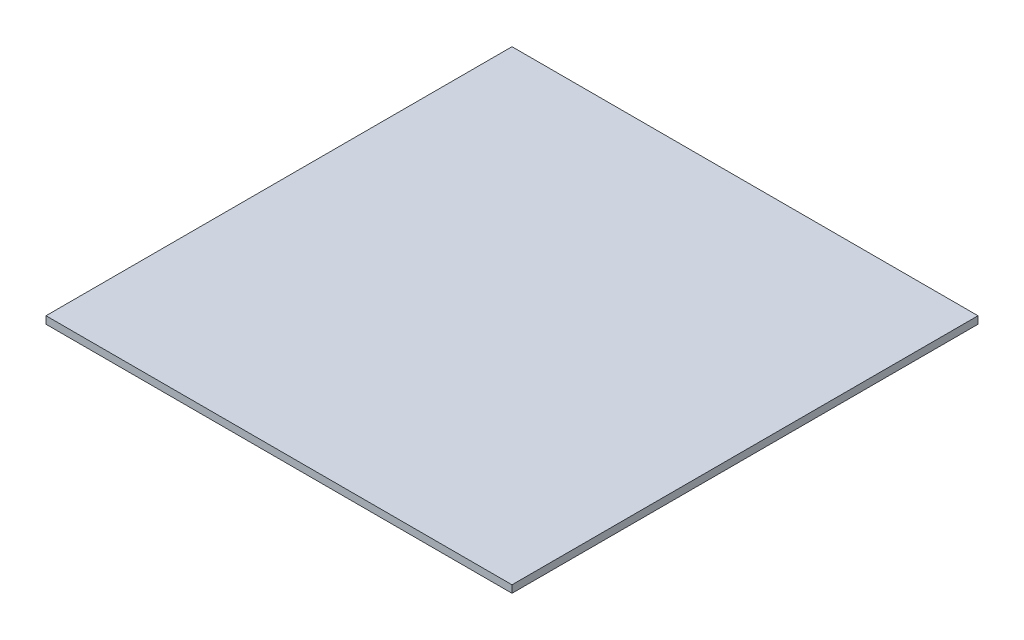
ISO-10303-21;
HEADER;
FILE_DESCRIPTION(('STEP AP214'),'2;1');
FILE_NAME('part.step','',(''),(''),'','','');
FILE_SCHEMA(('AUTOMOTIVE_DESIGN { 1 0 10303 214 1 1 1 1 }'));
ENDSEC;
DATA;
#1=APPLICATION_CONTEXT('core data for automotive mechanical design processes');
#2=APPLICATION_PROTOCOL_DEFINITION('international standard','automotive_design',2000,#1);
#3=PRODUCT_CONTEXT('',#1,'mechanical');
#4=PRODUCT('Part','Part','',(#3));
#5=PRODUCT_RELATED_PRODUCT_CATEGORY('part','',(#4));
#6=PRODUCT_DEFINITION_FORMATION('','',#4);
#7=PRODUCT_DEFINITION_CONTEXT('part definition',#1,'design');
#8=PRODUCT_DEFINITION('design','',#6,#7);
#9=PRODUCT_DEFINITION_SHAPE('','',#8);
#10=(LENGTH_UNIT() NAMED_UNIT(*) SI_UNIT(.MILLI.,.METRE.));
#11=(NAMED_UNIT(*) PLANE_ANGLE_UNIT() SI_UNIT($,.RADIAN.));
#12=(NAMED_UNIT(*) SI_UNIT($,.STERADIAN.) SOLID_ANGLE_UNIT());
#13=UNCERTAINTY_MEASURE_WITH_UNIT(LENGTH_MEASURE(1.E-05),#10,'distance_accuracy_value','');
#14=(GEOMETRIC_REPRESENTATION_CONTEXT(3) GLOBAL_UNCERTAINTY_ASSIGNED_CONTEXT((#13)) GLOBAL_UNIT_ASSIGNED_CONTEXT((#10,
#11,#12)) REPRESENTATION_CONTEXT('',''));
#15=CARTESIAN_POINT('',(0.,0.,0.));
#16=DIRECTION('',(0.,0.,1.));
#17=DIRECTION('',(1.,0.,0.));
#18=AXIS2_PLACEMENT_3D('',#15,#16,#17);
#19=CARTESIAN_POINT('',(100.,3.175,100.));
#20=DIRECTION('',(-1.,0.,0.));
#21=DIRECTION('',(0.,0.,1.));
#22=AXIS2_PLACEMENT_3D('',#19,#20,#21);
#23=PLANE('',#22);
#24=DIRECTION('',(0.,0.,-1.));
#25=VECTOR('',#24,1.);
#26=CARTESIAN_POINT('',(100.,0.,100.));
#27=LINE('',#26,#25);
#28=CARTESIAN_POINT('',(100.,0.,100.));
#29=VERTEX_POINT('',#28);
#30=CARTESIAN_POINT('',(100.,0.,-100.));
#31=VERTEX_POINT('',#30);
#32=EDGE_CURVE('E96',#29,#31,#27,.T.);
#33=ORIENTED_EDGE('',*,*,#32,.T.);
#34=DIRECTION('',(0.,-1.,0.));
#35=VECTOR('',#34,1.);
#36=CARTESIAN_POINT('',(100.,3.175,-100.));
#37=LINE('',#36,#35);
#38=CARTESIAN_POINT('',(100.,3.175,-100.));
#39=VERTEX_POINT('',#38);
#40=EDGE_CURVE('E11',#39,#31,#37,.T.);
#41=ORIENTED_EDGE('',*,*,#40,.F.);
#42=DIRECTION('',(0.,0.,-1.));
#43=VECTOR('',#42,1.);
#44=CARTESIAN_POINT('',(100.,3.175,100.));
#45=LINE('',#44,#43);
#46=CARTESIAN_POINT('',(100.,3.175,100.));
#47=VERTEX_POINT('',#46);
#48=EDGE_CURVE('E84',#47,#39,#45,.T.);
#49=ORIENTED_EDGE('',*,*,#48,.F.);
#50=DIRECTION('',(0.,-1.,0.));
#51=VECTOR('',#50,1.);
#52=CARTESIAN_POINT('',(100.,3.175,100.));
#53=LINE('',#52,#51);
#54=EDGE_CURVE('E92',#47,#29,#53,.T.);
#55=ORIENTED_EDGE('',*,*,#54,.T.);
#56=EDGE_LOOP('',(#33,#41,#49,#55));
#57=FACE_BOUND('',#56,.T.);
#58=ADVANCED_FACE('F33',(#57),#23,.F.);
#59=CARTESIAN_POINT('',(-100.,3.175,-100.));
#60=DIRECTION('',(0.,0.,1.));
#61=DIRECTION('',(1.,0.,0.));
#62=AXIS2_PLACEMENT_3D('',#59,#60,#61);
#63=PLANE('',#62);
#64=DIRECTION('',(-1.,0.,0.));
#65=VECTOR('',#64,1.);
#66=CARTESIAN_POINT('',(-100.,0.,-100.));
#67=LINE('',#66,#65);
#68=CARTESIAN_POINT('',(-100.,0.,-100.));
#69=VERTEX_POINT('',#68);
#70=EDGE_CURVE('E88',#31,#69,#67,.T.);
#71=ORIENTED_EDGE('',*,*,#70,.T.);
#72=DIRECTION('',(0.,-1.,0.));
#73=VECTOR('',#72,1.);
#74=CARTESIAN_POINT('',(-100.,3.175,-100.));
#75=LINE('',#74,#73);
#76=CARTESIAN_POINT('',(-100.,3.175,-100.));
#77=VERTEX_POINT('',#76);
#78=EDGE_CURVE('E41',#77,#69,#75,.T.);
#79=ORIENTED_EDGE('',*,*,#78,.F.);
#80=DIRECTION('',(-1.,0.,0.));
#81=VECTOR('',#80,1.);
#82=CARTESIAN_POINT('',(-100.,3.175,-100.));
#83=LINE('',#82,#81);
#84=EDGE_CURVE('E79',#39,#77,#83,.T.);
#85=ORIENTED_EDGE('',*,*,#84,.F.);
#86=ORIENTED_EDGE('',*,*,#40,.T.);
#87=EDGE_LOOP('',(#71,#79,#85,#86));
#88=FACE_BOUND('',#87,.T.);
#89=ADVANCED_FACE('F87',(#88),#63,.F.);
#90=CARTESIAN_POINT('',(-100.,3.175,100.));
#91=DIRECTION('',(1.,0.,0.));
#92=DIRECTION('',(0.,0.,-1.));
#93=AXIS2_PLACEMENT_3D('',#90,#91,#92);
#94=PLANE('',#93);
#95=DIRECTION('',(0.,0.,1.));
#96=VECTOR('',#95,1.);
#97=CARTESIAN_POINT('',(-100.,0.,100.));
#98=LINE('',#97,#96);
#99=CARTESIAN_POINT('',(-100.,0.,100.));
#100=VERTEX_POINT('',#99);
#101=EDGE_CURVE('E66',#69,#100,#98,.T.);
#102=ORIENTED_EDGE('',*,*,#101,.T.);
#103=DIRECTION('',(0.,-1.,0.));
#104=VECTOR('',#103,1.);
#105=CARTESIAN_POINT('',(-100.,3.175,100.));
#106=LINE('',#105,#104);
#107=CARTESIAN_POINT('',(-100.,3.175,100.));
#108=VERTEX_POINT('',#107);
#109=EDGE_CURVE('E89',#108,#100,#106,.T.);
#110=ORIENTED_EDGE('',*,*,#109,.F.);
#111=DIRECTION('',(0.,0.,1.));
#112=VECTOR('',#111,1.);
#113=CARTESIAN_POINT('',(-100.,3.175,100.));
#114=LINE('',#113,#112);
#115=EDGE_CURVE('E82',#77,#108,#114,.T.);
#116=ORIENTED_EDGE('',*,*,#115,.F.);
#117=ORIENTED_EDGE('',*,*,#78,.T.);
#118=EDGE_LOOP('',(#102,#110,#116,#117));
#119=FACE_BOUND('',#118,.T.);
#120=ADVANCED_FACE('F90',(#119),#94,.F.);
#121=CARTESIAN_POINT('',(-100.,3.175,100.));
#122=DIRECTION('',(0.,0.,-1.));
#123=DIRECTION('',(-1.,0.,0.));
#124=AXIS2_PLACEMENT_3D('',#121,#122,#123);
#125=PLANE('',#124);
#126=DIRECTION('',(1.,0.,0.));
#127=VECTOR('',#126,1.);
#128=CARTESIAN_POINT('',(-100.,0.,100.));
#129=LINE('',#128,#127);
#130=EDGE_CURVE('E72',#100,#29,#129,.T.);
#131=ORIENTED_EDGE('',*,*,#130,.T.);
#132=ORIENTED_EDGE('',*,*,#54,.F.);
#133=DIRECTION('',(1.,0.,0.));
#134=VECTOR('',#133,1.);
#135=CARTESIAN_POINT('',(-100.,3.175,100.));
#136=LINE('',#135,#134);
#137=EDGE_CURVE('E49',#108,#47,#136,.T.);
#138=ORIENTED_EDGE('',*,*,#137,.F.);
#139=ORIENTED_EDGE('',*,*,#109,.T.);
#140=EDGE_LOOP('',(#131,#132,#138,#139));
#141=FACE_BOUND('',#140,.T.);
#142=ADVANCED_FACE('F103',(#141),#125,.F.);
#143=CARTESIAN_POINT('',(0.,3.175,0.));
#144=DIRECTION('',(0.,-1.,0.));
#145=DIRECTION('',(0.,0.,-1.));
#146=AXIS2_PLACEMENT_3D('',#143,#144,#145);
#147=PLANE('',#146);
#148=ORIENTED_EDGE('',*,*,#48,.T.);
#149=ORIENTED_EDGE('',*,*,#84,.T.);
#150=ORIENTED_EDGE('',*,*,#115,.T.);
#151=ORIENTED_EDGE('',*,*,#137,.T.);
#152=EDGE_LOOP('',(#148,#149,#150,#151));
#153=FACE_BOUND('',#152,.T.);
#154=ADVANCED_FACE('F80',(#153),#147,.F.);
#155=CARTESIAN_POINT('',(0.,0.,0.));
#156=DIRECTION('',(0.,-1.,0.));
#157=DIRECTION('',(0.,0.,-1.));
#158=AXIS2_PLACEMENT_3D('',#155,#156,#157);
#159=PLANE('',#158);
#160=ORIENTED_EDGE('',*,*,#32,.F.);
#161=ORIENTED_EDGE('',*,*,#130,.F.);
#162=ORIENTED_EDGE('',*,*,#101,.F.);
#163=ORIENTED_EDGE('',*,*,#70,.F.);
#164=EDGE_LOOP('',(#160,#161,#162,#163));
#165=FACE_BOUND('',#164,.T.);
#166=ADVANCED_FACE('F106',(#165),#159,.T.);
#167=CLOSED_SHELL('',(#58,#89,#120,#142,#154,#166));
#168=MANIFOLD_SOLID_BREP('B2',#167);
#169=ADVANCED_BREP_SHAPE_REPRESENTATION('',(#18,#168),#14);
#170=SHAPE_DEFINITION_REPRESENTATION(#9,#169);
ENDSEC;
END-ISO-10303-21;
